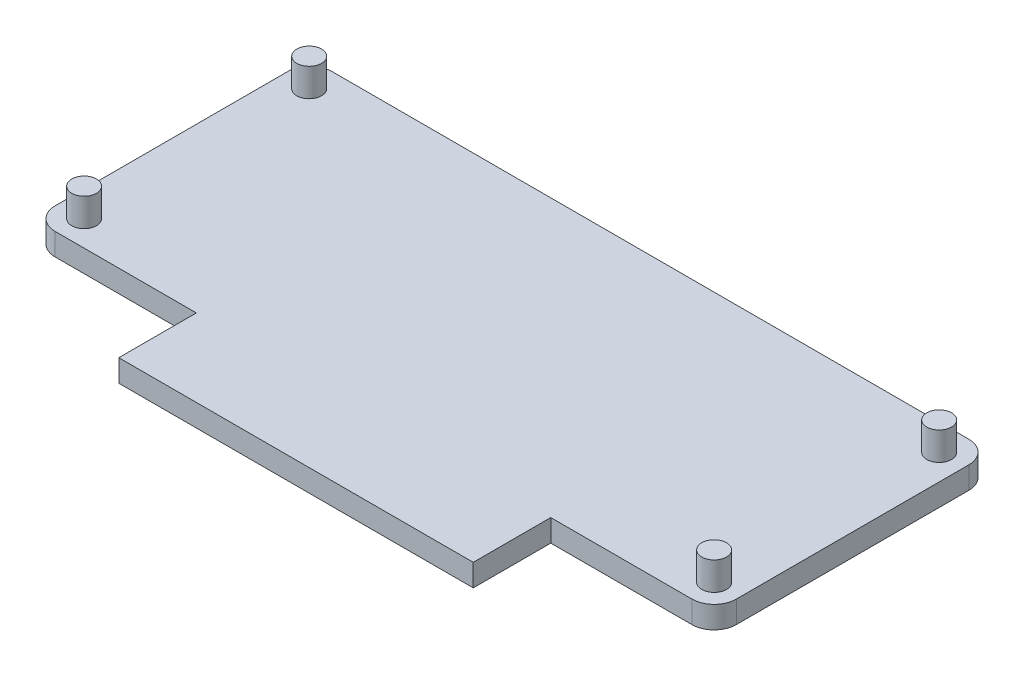
ISO-10303-21;
HEADER;
FILE_DESCRIPTION(('STEP AP214'),'2;1');
FILE_NAME('part.step','',(''),(''),'','','');
FILE_SCHEMA(('AUTOMOTIVE_DESIGN { 1 0 10303 214 1 1 1 1 }'));
ENDSEC;
DATA;
#1=APPLICATION_CONTEXT('core data for automotive mechanical design processes');
#2=APPLICATION_PROTOCOL_DEFINITION('international standard','automotive_design',2000,#1);
#3=PRODUCT_CONTEXT('',#1,'mechanical');
#4=PRODUCT('Part','Part','',(#3));
#5=PRODUCT_RELATED_PRODUCT_CATEGORY('part','',(#4));
#6=PRODUCT_DEFINITION_FORMATION('','',#4);
#7=PRODUCT_DEFINITION_CONTEXT('part definition',#1,'design');
#8=PRODUCT_DEFINITION('design','',#6,#7);
#9=PRODUCT_DEFINITION_SHAPE('','',#8);
#10=(LENGTH_UNIT() NAMED_UNIT(*) SI_UNIT(.MILLI.,.METRE.));
#11=(NAMED_UNIT(*) PLANE_ANGLE_UNIT() SI_UNIT($,.RADIAN.));
#12=(NAMED_UNIT(*) SI_UNIT($,.STERADIAN.) SOLID_ANGLE_UNIT());
#13=UNCERTAINTY_MEASURE_WITH_UNIT(LENGTH_MEASURE(1.E-05),#10,'distance_accuracy_value','');
#14=(GEOMETRIC_REPRESENTATION_CONTEXT(3) GLOBAL_UNCERTAINTY_ASSIGNED_CONTEXT((#13)) GLOBAL_UNIT_ASSIGNED_CONTEXT((#10,
#11,#12)) REPRESENTATION_CONTEXT('',''));
#15=CARTESIAN_POINT('',(0.,0.,0.));
#16=DIRECTION('',(0.,0.,1.));
#17=DIRECTION('',(1.,0.,0.));
#18=AXIS2_PLACEMENT_3D('',#15,#16,#17);
#19=CARTESIAN_POINT('',(-16.,2.,0.));
#20=DIRECTION('',(1.,0.,0.));
#21=DIRECTION('',(0.,0.,-1.));
#22=AXIS2_PLACEMENT_3D('',#19,#20,#21);
#23=PLANE('',#22);
#24=DIRECTION('',(0.,0.,1.));
#25=VECTOR('',#24,1.);
#26=CARTESIAN_POINT('',(-16.,0.,0.));
#27=LINE('',#26,#25);
#28=CARTESIAN_POINT('',(-16.,0.,-7.));
#29=VERTEX_POINT('',#28);
#30=CARTESIAN_POINT('',(-16.,0.,0.));
#31=VERTEX_POINT('',#30);
#32=EDGE_CURVE('E165',#29,#31,#27,.T.);
#33=ORIENTED_EDGE('',*,*,#32,.T.);
#34=DIRECTION('',(0.,-1.,0.));
#35=VECTOR('',#34,1.);
#36=CARTESIAN_POINT('',(-16.,2.,0.));
#37=LINE('',#36,#35);
#38=CARTESIAN_POINT('',(-16.,2.,0.));
#39=VERTEX_POINT('',#38);
#40=EDGE_CURVE('E145',#39,#31,#37,.T.);
#41=ORIENTED_EDGE('',*,*,#40,.F.);
#42=DIRECTION('',(0.,0.,1.));
#43=VECTOR('',#42,1.);
#44=CARTESIAN_POINT('',(-16.,2.,0.));
#45=LINE('',#44,#43);
#46=CARTESIAN_POINT('',(-16.,2.,-7.));
#47=VERTEX_POINT('',#46);
#48=EDGE_CURVE('E152',#47,#39,#45,.T.);
#49=ORIENTED_EDGE('',*,*,#48,.F.);
#50=DIRECTION('',(0.,-1.,0.));
#51=VECTOR('',#50,1.);
#52=CARTESIAN_POINT('',(-16.,2.,-7.));
#53=LINE('',#52,#51);
#54=EDGE_CURVE('E246',#47,#29,#53,.T.);
#55=ORIENTED_EDGE('',*,*,#54,.T.);
#56=EDGE_LOOP('',(#33,#41,#49,#55));
#57=FACE_BOUND('',#56,.T.);
#58=ADVANCED_FACE('F49',(#57),#23,.F.);
#59=CARTESIAN_POINT('',(-16.,2.,0.));
#60=DIRECTION('',(0.,0.,-1.));
#61=DIRECTION('',(-1.,0.,0.));
#62=AXIS2_PLACEMENT_3D('',#59,#60,#61);
#63=PLANE('',#62);
#64=DIRECTION('',(1.,0.,0.));
#65=VECTOR('',#64,1.);
#66=CARTESIAN_POINT('',(-16.,0.,0.));
#67=LINE('',#66,#65);
#68=CARTESIAN_POINT('',(16.,0.,0.));
#69=VERTEX_POINT('',#68);
#70=EDGE_CURVE('E268',#31,#69,#67,.T.);
#71=ORIENTED_EDGE('',*,*,#70,.T.);
#72=DIRECTION('',(0.,-1.,0.));
#73=VECTOR('',#72,1.);
#74=CARTESIAN_POINT('',(16.,2.,0.));
#75=LINE('',#74,#73);
#76=CARTESIAN_POINT('',(16.,2.,0.));
#77=VERTEX_POINT('',#76);
#78=EDGE_CURVE('E148',#77,#69,#75,.T.);
#79=ORIENTED_EDGE('',*,*,#78,.F.);
#80=DIRECTION('',(1.,0.,0.));
#81=VECTOR('',#80,1.);
#82=CARTESIAN_POINT('',(-16.,2.,0.));
#83=LINE('',#82,#81);
#84=EDGE_CURVE('E141',#39,#77,#83,.T.);
#85=ORIENTED_EDGE('',*,*,#84,.F.);
#86=ORIENTED_EDGE('',*,*,#40,.T.);
#87=EDGE_LOOP('',(#71,#79,#85,#86));
#88=FACE_BOUND('',#87,.T.);
#89=ADVANCED_FACE('F143',(#88),#63,.F.);
#90=CARTESIAN_POINT('',(16.,2.,0.));
#91=DIRECTION('',(-1.,0.,0.));
#92=DIRECTION('',(0.,0.,1.));
#93=AXIS2_PLACEMENT_3D('',#90,#91,#92);
#94=PLANE('',#93);
#95=DIRECTION('',(0.,0.,-1.));
#96=VECTOR('',#95,1.);
#97=CARTESIAN_POINT('',(16.,0.,0.));
#98=LINE('',#97,#96);
#99=CARTESIAN_POINT('',(16.,0.,-7.));
#100=VERTEX_POINT('',#99);
#101=EDGE_CURVE('E262',#69,#100,#98,.T.);
#102=ORIENTED_EDGE('',*,*,#101,.T.);
#103=DIRECTION('',(0.,-1.,0.));
#104=VECTOR('',#103,1.);
#105=CARTESIAN_POINT('',(16.,2.,-7.));
#106=LINE('',#105,#104);
#107=CARTESIAN_POINT('',(16.,2.,-7.));
#108=VERTEX_POINT('',#107);
#109=EDGE_CURVE('E175',#108,#100,#106,.T.);
#110=ORIENTED_EDGE('',*,*,#109,.F.);
#111=DIRECTION('',(0.,0.,-1.));
#112=VECTOR('',#111,1.);
#113=CARTESIAN_POINT('',(16.,2.,0.));
#114=LINE('',#113,#112);
#115=EDGE_CURVE('E151',#77,#108,#114,.T.);
#116=ORIENTED_EDGE('',*,*,#115,.F.);
#117=ORIENTED_EDGE('',*,*,#78,.T.);
#118=EDGE_LOOP('',(#102,#110,#116,#117));
#119=FACE_BOUND('',#118,.T.);
#120=ADVANCED_FACE('F351',(#119),#94,.F.);
#121=CARTESIAN_POINT('',(16.,2.,-7.));
#122=DIRECTION('',(0.,0.,-1.));
#123=DIRECTION('',(-1.,0.,0.));
#124=AXIS2_PLACEMENT_3D('',#121,#122,#123);
#125=PLANE('',#124);
#126=DIRECTION('',(1.,0.,0.));
#127=VECTOR('',#126,1.);
#128=CARTESIAN_POINT('',(16.,0.,-7.));
#129=LINE('',#128,#127);
#130=CARTESIAN_POINT('',(28.75,0.,-7.));
#131=VERTEX_POINT('',#130);
#132=EDGE_CURVE('E257',#100,#131,#129,.T.);
#133=ORIENTED_EDGE('',*,*,#132,.T.);
#134=DIRECTION('',(0.,-1.,0.));
#135=VECTOR('',#134,1.);
#136=CARTESIAN_POINT('',(28.75,2.,-7.));
#137=LINE('',#136,#135);
#138=CARTESIAN_POINT('',(28.75,2.,-7.));
#139=VERTEX_POINT('',#138);
#140=EDGE_CURVE('E194',#131,#139,#137,.F.);
#141=ORIENTED_EDGE('',*,*,#140,.T.);
#142=DIRECTION('',(1.,0.,0.));
#143=VECTOR('',#142,1.);
#144=CARTESIAN_POINT('',(16.,2.,-7.));
#145=LINE('',#144,#143);
#146=EDGE_CURVE('E259',#108,#139,#145,.T.);
#147=ORIENTED_EDGE('',*,*,#146,.F.);
#148=ORIENTED_EDGE('',*,*,#109,.T.);
#149=EDGE_LOOP('',(#133,#141,#147,#148));
#150=FACE_BOUND('',#149,.T.);
#151=ADVANCED_FACE('F256',(#150),#125,.F.);
#152=CARTESIAN_POINT('',(30.75,2.,-7.));
#153=DIRECTION('',(-1.,0.,0.));
#154=DIRECTION('',(0.,0.,1.));
#155=AXIS2_PLACEMENT_3D('',#152,#153,#154);
#156=PLANE('',#155);
#157=DIRECTION('',(0.,0.,-1.));
#158=VECTOR('',#157,1.);
#159=CARTESIAN_POINT('',(30.75,2.,-7.));
#160=LINE('',#159,#158);
#161=CARTESIAN_POINT('',(30.75,2.,-9.));
#162=VERTEX_POINT('',#161);
#163=CARTESIAN_POINT('',(30.75,2.,-30.));
#164=VERTEX_POINT('',#163);
#165=EDGE_CURVE('E283',#162,#164,#160,.T.);
#166=ORIENTED_EDGE('',*,*,#165,.F.);
#167=DIRECTION('',(0.,-1.,0.));
#168=VECTOR('',#167,1.);
#169=CARTESIAN_POINT('',(30.75,2.,-9.));
#170=LINE('',#169,#168);
#171=CARTESIAN_POINT('',(30.75,0.,-9.));
#172=VERTEX_POINT('',#171);
#173=EDGE_CURVE('E172',#162,#172,#170,.T.);
#174=ORIENTED_EDGE('',*,*,#173,.T.);
#175=DIRECTION('',(0.,0.,-1.));
#176=VECTOR('',#175,1.);
#177=CARTESIAN_POINT('',(30.75,0.,-7.));
#178=LINE('',#177,#176);
#179=CARTESIAN_POINT('',(30.75,0.,-30.));
#180=VERTEX_POINT('',#179);
#181=EDGE_CURVE('E242',#172,#180,#178,.T.);
#182=ORIENTED_EDGE('',*,*,#181,.T.);
#183=DIRECTION('',(0.,-1.,0.));
#184=VECTOR('',#183,1.);
#185=CARTESIAN_POINT('',(30.75,2.,-30.));
#186=LINE('',#185,#184);
#187=EDGE_CURVE('E167',#180,#164,#186,.F.);
#188=ORIENTED_EDGE('',*,*,#187,.T.);
#189=EDGE_LOOP('',(#166,#174,#182,#188));
#190=FACE_BOUND('',#189,.T.);
#191=ADVANCED_FACE('F377',(#190),#156,.F.);
#192=CARTESIAN_POINT('',(-30.75,2.,-32.));
#193=DIRECTION('',(0.,0.,1.));
#194=DIRECTION('',(1.,0.,0.));
#195=AXIS2_PLACEMENT_3D('',#192,#193,#194);
#196=PLANE('',#195);
#197=DIRECTION('',(-1.,0.,0.));
#198=VECTOR('',#197,1.);
#199=CARTESIAN_POINT('',(-30.75,2.,-32.));
#200=LINE('',#199,#198);
#201=CARTESIAN_POINT('',(28.75,2.,-32.));
#202=VERTEX_POINT('',#201);
#203=CARTESIAN_POINT('',(-28.75,2.,-32.));
#204=VERTEX_POINT('',#203);
#205=EDGE_CURVE('E279',#202,#204,#200,.T.);
#206=ORIENTED_EDGE('',*,*,#205,.F.);
#207=DIRECTION('',(0.,-1.,0.));
#208=VECTOR('',#207,1.);
#209=CARTESIAN_POINT('',(28.75,2.,-32.));
#210=LINE('',#209,#208);
#211=CARTESIAN_POINT('',(28.75,0.,-32.));
#212=VERTEX_POINT('',#211);
#213=EDGE_CURVE('E211',#202,#212,#210,.T.);
#214=ORIENTED_EDGE('',*,*,#213,.T.);
#215=DIRECTION('',(-1.,0.,0.));
#216=VECTOR('',#215,1.);
#217=CARTESIAN_POINT('',(-30.75,0.,-32.));
#218=LINE('',#217,#216);
#219=CARTESIAN_POINT('',(-28.75,0.,-32.));
#220=VERTEX_POINT('',#219);
#221=EDGE_CURVE('E235',#212,#220,#218,.T.);
#222=ORIENTED_EDGE('',*,*,#221,.T.);
#223=DIRECTION('',(0.,-1.,0.));
#224=VECTOR('',#223,1.);
#225=CARTESIAN_POINT('',(-28.75,2.,-32.));
#226=LINE('',#225,#224);
#227=EDGE_CURVE('E208',#220,#204,#226,.F.);
#228=ORIENTED_EDGE('',*,*,#227,.T.);
#229=EDGE_LOOP('',(#206,#214,#222,#228));
#230=FACE_BOUND('',#229,.T.);
#231=ADVANCED_FACE('F373',(#230),#196,.F.);
#232=CARTESIAN_POINT('',(-30.75,2.,-7.));
#233=DIRECTION('',(1.,0.,0.));
#234=DIRECTION('',(0.,0.,-1.));
#235=AXIS2_PLACEMENT_3D('',#232,#233,#234);
#236=PLANE('',#235);
#237=DIRECTION('',(0.,0.,1.));
#238=VECTOR('',#237,1.);
#239=CARTESIAN_POINT('',(-30.75,2.,-7.));
#240=LINE('',#239,#238);
#241=CARTESIAN_POINT('',(-30.75,2.,-30.));
#242=VERTEX_POINT('',#241);
#243=CARTESIAN_POINT('',(-30.75,2.,-9.));
#244=VERTEX_POINT('',#243);
#245=EDGE_CURVE('E225',#242,#244,#240,.T.);
#246=ORIENTED_EDGE('',*,*,#245,.F.);
#247=DIRECTION('',(0.,-1.,0.));
#248=VECTOR('',#247,1.);
#249=CARTESIAN_POINT('',(-30.75,2.,-30.));
#250=LINE('',#249,#248);
#251=CARTESIAN_POINT('',(-30.75,0.,-30.));
#252=VERTEX_POINT('',#251);
#253=EDGE_CURVE('E58',#242,#252,#250,.T.);
#254=ORIENTED_EDGE('',*,*,#253,.T.);
#255=DIRECTION('',(0.,0.,1.));
#256=VECTOR('',#255,1.);
#257=CARTESIAN_POINT('',(-30.75,0.,-7.));
#258=LINE('',#257,#256);
#259=CARTESIAN_POINT('',(-30.75,0.,-9.));
#260=VERTEX_POINT('',#259);
#261=EDGE_CURVE('E224',#252,#260,#258,.T.);
#262=ORIENTED_EDGE('',*,*,#261,.T.);
#263=DIRECTION('',(0.,-1.,0.));
#264=VECTOR('',#263,1.);
#265=CARTESIAN_POINT('',(-30.75,2.,-9.));
#266=LINE('',#265,#264);
#267=EDGE_CURVE('E73',#260,#244,#266,.F.);
#268=ORIENTED_EDGE('',*,*,#267,.T.);
#269=EDGE_LOOP('',(#246,#254,#262,#268));
#270=FACE_BOUND('',#269,.T.);
#271=ADVANCED_FACE('F223',(#270),#236,.F.);
#272=CARTESIAN_POINT('',(-16.,2.,-7.));
#273=DIRECTION('',(0.,0.,-1.));
#274=DIRECTION('',(-1.,0.,0.));
#275=AXIS2_PLACEMENT_3D('',#272,#273,#274);
#276=PLANE('',#275);
#277=DIRECTION('',(1.,0.,0.));
#278=VECTOR('',#277,1.);
#279=CARTESIAN_POINT('',(-16.,2.,-7.));
#280=LINE('',#279,#278);
#281=CARTESIAN_POINT('',(-28.75,2.,-7.));
#282=VERTEX_POINT('',#281);
#283=EDGE_CURVE('E157',#282,#47,#280,.T.);
#284=ORIENTED_EDGE('',*,*,#283,.F.);
#285=DIRECTION('',(0.,-1.,0.));
#286=VECTOR('',#285,1.);
#287=CARTESIAN_POINT('',(-28.75,2.,-7.));
#288=LINE('',#287,#286);
#289=CARTESIAN_POINT('',(-28.75,0.,-7.));
#290=VERTEX_POINT('',#289);
#291=EDGE_CURVE('E11',#282,#290,#288,.T.);
#292=ORIENTED_EDGE('',*,*,#291,.T.);
#293=DIRECTION('',(1.,0.,0.));
#294=VECTOR('',#293,1.);
#295=CARTESIAN_POINT('',(-16.,0.,-7.));
#296=LINE('',#295,#294);
#297=EDGE_CURVE('E162',#290,#29,#296,.T.);
#298=ORIENTED_EDGE('',*,*,#297,.T.);
#299=ORIENTED_EDGE('',*,*,#54,.F.);
#300=EDGE_LOOP('',(#284,#292,#298,#299));
#301=FACE_BOUND('',#300,.T.);
#302=ADVANCED_FACE('F326',(#301),#276,.F.);
#303=CARTESIAN_POINT('',(0.,2.,0.));
#304=DIRECTION('',(0.,1.,0.));
#305=DIRECTION('',(0.,0.,1.));
#306=AXIS2_PLACEMENT_3D('',#303,#304,#305);
#307=PLANE('',#306);
#308=CARTESIAN_POINT('',(28.44076,2.,-9.31));
#309=DIRECTION('',(0.,1.,0.));
#310=DIRECTION('',(0.,0.,1.));
#311=AXIS2_PLACEMENT_3D('',#308,#309,#310);
#312=CIRCLE('',#311,1.1176);
#313=CARTESIAN_POINT('',(28.44076,2.,-8.1924));
#314=VERTEX_POINT('',#313);
#315=EDGE_CURVE('E309',#314,#314,#312,.T.);
#316=ORIENTED_EDGE('',*,*,#315,.F.);
#317=EDGE_LOOP('',(#316));
#318=FACE_BOUND('',#317,.T.);
#319=CARTESIAN_POINT('',(28.44076,2.,-29.63));
#320=DIRECTION('',(0.,1.,0.));
#321=DIRECTION('',(0.,0.,1.));
#322=AXIS2_PLACEMENT_3D('',#319,#320,#321);
#323=CIRCLE('',#322,1.1176);
#324=CARTESIAN_POINT('',(28.44076,2.,-28.5124));
#325=VERTEX_POINT('',#324);
#326=EDGE_CURVE('E302',#325,#325,#323,.T.);
#327=ORIENTED_EDGE('',*,*,#326,.F.);
#328=EDGE_LOOP('',(#327));
#329=FACE_BOUND('',#328,.T.);
#330=CARTESIAN_POINT('',(-28.44,2.,-29.63));
#331=DIRECTION('',(0.,1.,0.));
#332=DIRECTION('',(0.,0.,1.));
#333=AXIS2_PLACEMENT_3D('',#330,#331,#332);
#334=CIRCLE('',#333,1.1176);
#335=CARTESIAN_POINT('',(-28.44,2.,-28.5124));
#336=VERTEX_POINT('',#335);
#337=EDGE_CURVE('E294',#336,#336,#334,.T.);
#338=ORIENTED_EDGE('',*,*,#337,.F.);
#339=EDGE_LOOP('',(#338));
#340=FACE_BOUND('',#339,.T.);
#341=CARTESIAN_POINT('',(-28.44,2.,-9.31));
#342=DIRECTION('',(0.,1.,0.));
#343=DIRECTION('',(0.,0.,1.));
#344=AXIS2_PLACEMENT_3D('',#341,#342,#343);
#345=CIRCLE('',#344,1.1176);
#346=CARTESIAN_POINT('',(-28.44,2.,-8.1924));
#347=VERTEX_POINT('',#346);
#348=EDGE_CURVE('E291',#347,#347,#345,.T.);
#349=ORIENTED_EDGE('',*,*,#348,.F.);
#350=EDGE_LOOP('',(#349));
#351=FACE_BOUND('',#350,.T.);
#352=ORIENTED_EDGE('',*,*,#146,.T.);
#353=CARTESIAN_POINT('',(28.75,2.,-9.));
#354=DIRECTION('',(0.,1.,0.));
#355=DIRECTION('',(0.,0.,1.));
#356=AXIS2_PLACEMENT_3D('',#353,#354,#355);
#357=CIRCLE('',#356,2.);
#358=EDGE_CURVE('E205',#139,#162,#357,.T.);
#359=ORIENTED_EDGE('',*,*,#358,.T.);
#360=ORIENTED_EDGE('',*,*,#165,.T.);
#361=CARTESIAN_POINT('',(28.75,2.,-30.));
#362=DIRECTION('',(0.,1.,0.));
#363=DIRECTION('',(0.,0.,1.));
#364=AXIS2_PLACEMENT_3D('',#361,#362,#363);
#365=CIRCLE('',#364,2.);
#366=EDGE_CURVE('E202',#164,#202,#365,.T.);
#367=ORIENTED_EDGE('',*,*,#366,.T.);
#368=ORIENTED_EDGE('',*,*,#205,.T.);
#369=CARTESIAN_POINT('',(-28.75,2.,-30.));
#370=DIRECTION('',(0.,1.,0.));
#371=DIRECTION('',(0.,0.,1.));
#372=AXIS2_PLACEMENT_3D('',#369,#370,#371);
#373=CIRCLE('',#372,2.);
#374=EDGE_CURVE('E199',#204,#242,#373,.T.);
#375=ORIENTED_EDGE('',*,*,#374,.T.);
#376=ORIENTED_EDGE('',*,*,#245,.T.);
#377=CARTESIAN_POINT('',(-28.75,2.,-9.));
#378=DIRECTION('',(0.,1.,0.));
#379=DIRECTION('',(0.,0.,1.));
#380=AXIS2_PLACEMENT_3D('',#377,#378,#379);
#381=CIRCLE('',#380,2.);
#382=EDGE_CURVE('E65',#244,#282,#381,.T.);
#383=ORIENTED_EDGE('',*,*,#382,.T.);
#384=ORIENTED_EDGE('',*,*,#283,.T.);
#385=ORIENTED_EDGE('',*,*,#48,.T.);
#386=ORIENTED_EDGE('',*,*,#84,.T.);
#387=ORIENTED_EDGE('',*,*,#115,.T.);
#388=EDGE_LOOP('',(#352,#359,#360,#367,#368,#375,#376,#383,#384,#385,#386,#387));
#389=FACE_BOUND('',#388,.T.);
#390=ADVANCED_FACE('F156',(#318,#329,#340,#351,#389),#307,.T.);
#391=CARTESIAN_POINT('',(0.,0.,0.));
#392=DIRECTION('',(0.,1.,0.));
#393=DIRECTION('',(0.,0.,1.));
#394=AXIS2_PLACEMENT_3D('',#391,#392,#393);
#395=PLANE('',#394);
#396=ORIENTED_EDGE('',*,*,#181,.F.);
#397=CARTESIAN_POINT('',(28.75,0.,-9.));
#398=DIRECTION('',(0.,1.,0.));
#399=DIRECTION('',(0.,0.,1.));
#400=AXIS2_PLACEMENT_3D('',#397,#398,#399);
#401=CIRCLE('',#400,2.);
#402=EDGE_CURVE('E191',#172,#131,#401,.F.);
#403=ORIENTED_EDGE('',*,*,#402,.T.);
#404=ORIENTED_EDGE('',*,*,#132,.F.);
#405=ORIENTED_EDGE('',*,*,#101,.F.);
#406=ORIENTED_EDGE('',*,*,#70,.F.);
#407=ORIENTED_EDGE('',*,*,#32,.F.);
#408=ORIENTED_EDGE('',*,*,#297,.F.);
#409=CARTESIAN_POINT('',(-28.75,0.,-9.));
#410=DIRECTION('',(0.,1.,0.));
#411=DIRECTION('',(0.,0.,1.));
#412=AXIS2_PLACEMENT_3D('',#409,#410,#411);
#413=CIRCLE('',#412,2.);
#414=EDGE_CURVE('E182',#290,#260,#413,.F.);
#415=ORIENTED_EDGE('',*,*,#414,.T.);
#416=ORIENTED_EDGE('',*,*,#261,.F.);
#417=CARTESIAN_POINT('',(-28.75,0.,-30.));
#418=DIRECTION('',(0.,1.,0.));
#419=DIRECTION('',(0.,0.,1.));
#420=AXIS2_PLACEMENT_3D('',#417,#418,#419);
#421=CIRCLE('',#420,2.);
#422=EDGE_CURVE('E185',#252,#220,#421,.F.);
#423=ORIENTED_EDGE('',*,*,#422,.T.);
#424=ORIENTED_EDGE('',*,*,#221,.F.);
#425=CARTESIAN_POINT('',(28.75,0.,-30.));
#426=DIRECTION('',(0.,1.,0.));
#427=DIRECTION('',(0.,0.,1.));
#428=AXIS2_PLACEMENT_3D('',#425,#426,#427);
#429=CIRCLE('',#428,2.);
#430=EDGE_CURVE('E188',#212,#180,#429,.F.);
#431=ORIENTED_EDGE('',*,*,#430,.T.);
#432=EDGE_LOOP('',(#396,#403,#404,#405,#406,#407,#408,#415,#416,#423,#424,#431));
#433=FACE_BOUND('',#432,.T.);
#434=ADVANCED_FACE('F230',(#433),#395,.F.);
#435=CARTESIAN_POINT('',(-28.44,4.54,-9.31));
#436=DIRECTION('',(0.,-1.,0.));
#437=DIRECTION('',(0.,0.,-1.));
#438=AXIS2_PLACEMENT_3D('',#435,#436,#437);
#439=CYLINDRICAL_SURFACE('',#438,1.1176);
#440=CARTESIAN_POINT('',(-28.44,4.54,-9.31));
#441=DIRECTION('',(0.,1.,0.));
#442=DIRECTION('',(0.,0.,1.));
#443=AXIS2_PLACEMENT_3D('',#440,#441,#442);
#444=CIRCLE('',#443,1.1176);
#445=CARTESIAN_POINT('',(-28.44,4.54,-8.1924));
#446=VERTEX_POINT('',#445);
#447=EDGE_CURVE('E275',#446,#446,#444,.T.);
#448=ORIENTED_EDGE('',*,*,#447,.F.);
#449=EDGE_LOOP('',(#448));
#450=FACE_BOUND('',#449,.T.);
#451=ORIENTED_EDGE('',*,*,#348,.T.);
#452=EDGE_LOOP('',(#451));
#453=FACE_BOUND('',#452,.T.);
#454=ADVANCED_FACE('F334',(#450,#453),#439,.T.);
#455=CARTESIAN_POINT('',(-28.44,4.54,-9.31));
#456=DIRECTION('',(0.,1.,0.));
#457=DIRECTION('',(0.,0.,1.));
#458=AXIS2_PLACEMENT_3D('',#455,#456,#457);
#459=PLANE('',#458);
#460=ORIENTED_EDGE('',*,*,#447,.T.);
#461=EDGE_LOOP('',(#460));
#462=FACE_BOUND('',#461,.T.);
#463=ADVANCED_FACE('F336',(#462),#459,.T.);
#464=CARTESIAN_POINT('',(-28.44,4.54,-29.63));
#465=DIRECTION('',(0.,-1.,0.));
#466=DIRECTION('',(0.,0.,-1.));
#467=AXIS2_PLACEMENT_3D('',#464,#465,#466);
#468=CYLINDRICAL_SURFACE('',#467,1.1176);
#469=CARTESIAN_POINT('',(-28.44,4.54,-29.63));
#470=DIRECTION('',(0.,1.,0.));
#471=DIRECTION('',(0.,0.,1.));
#472=AXIS2_PLACEMENT_3D('',#469,#470,#471);
#473=CIRCLE('',#472,1.1176);
#474=CARTESIAN_POINT('',(-28.44,4.54,-28.5124));
#475=VERTEX_POINT('',#474);
#476=EDGE_CURVE('E298',#475,#475,#473,.T.);
#477=ORIENTED_EDGE('',*,*,#476,.F.);
#478=EDGE_LOOP('',(#477));
#479=FACE_BOUND('',#478,.T.);
#480=ORIENTED_EDGE('',*,*,#337,.T.);
#481=EDGE_LOOP('',(#480));
#482=FACE_BOUND('',#481,.T.);
#483=ADVANCED_FACE('F342',(#479,#482),#468,.T.);
#484=CARTESIAN_POINT('',(-28.44,4.54,-29.63));
#485=DIRECTION('',(0.,1.,0.));
#486=DIRECTION('',(0.,0.,1.));
#487=AXIS2_PLACEMENT_3D('',#484,#485,#486);
#488=PLANE('',#487);
#489=ORIENTED_EDGE('',*,*,#476,.T.);
#490=EDGE_LOOP('',(#489));
#491=FACE_BOUND('',#490,.T.);
#492=ADVANCED_FACE('F469',(#491),#488,.T.);
#493=CARTESIAN_POINT('',(28.44076,4.54,-29.63));
#494=DIRECTION('',(0.,-1.,0.));
#495=DIRECTION('',(0.,0.,-1.));
#496=AXIS2_PLACEMENT_3D('',#493,#494,#495);
#497=CYLINDRICAL_SURFACE('',#496,1.1176);
#498=CARTESIAN_POINT('',(28.44076,4.54,-29.63));
#499=DIRECTION('',(0.,1.,0.));
#500=DIRECTION('',(0.,0.,1.));
#501=AXIS2_PLACEMENT_3D('',#498,#499,#500);
#502=CIRCLE('',#501,1.1176);
#503=CARTESIAN_POINT('',(28.44076,4.54,-28.5124));
#504=VERTEX_POINT('',#503);
#505=EDGE_CURVE('E306',#504,#504,#502,.T.);
#506=ORIENTED_EDGE('',*,*,#505,.F.);
#507=EDGE_LOOP('',(#506));
#508=FACE_BOUND('',#507,.T.);
#509=ORIENTED_EDGE('',*,*,#326,.T.);
#510=EDGE_LOOP('',(#509));
#511=FACE_BOUND('',#510,.T.);
#512=ADVANCED_FACE('F459',(#508,#511),#497,.T.);
#513=CARTESIAN_POINT('',(28.44076,4.54,-29.63));
#514=DIRECTION('',(0.,1.,0.));
#515=DIRECTION('',(0.,0.,1.));
#516=AXIS2_PLACEMENT_3D('',#513,#514,#515);
#517=PLANE('',#516);
#518=ORIENTED_EDGE('',*,*,#505,.T.);
#519=EDGE_LOOP('',(#518));
#520=FACE_BOUND('',#519,.T.);
#521=ADVANCED_FACE('F449',(#520),#517,.T.);
#522=CARTESIAN_POINT('',(28.44076,4.54,-9.31));
#523=DIRECTION('',(0.,-1.,0.));
#524=DIRECTION('',(0.,0.,-1.));
#525=AXIS2_PLACEMENT_3D('',#522,#523,#524);
#526=CYLINDRICAL_SURFACE('',#525,1.1176);
#527=CARTESIAN_POINT('',(28.44076,4.54,-9.31));
#528=DIRECTION('',(0.,1.,0.));
#529=DIRECTION('',(0.,0.,1.));
#530=AXIS2_PLACEMENT_3D('',#527,#528,#529);
#531=CIRCLE('',#530,1.1176);
#532=CARTESIAN_POINT('',(28.44076,4.54,-8.1924));
#533=VERTEX_POINT('',#532);
#534=EDGE_CURVE('E313',#533,#533,#531,.T.);
#535=ORIENTED_EDGE('',*,*,#534,.F.);
#536=EDGE_LOOP('',(#535));
#537=FACE_BOUND('',#536,.T.);
#538=ORIENTED_EDGE('',*,*,#315,.T.);
#539=EDGE_LOOP('',(#538));
#540=FACE_BOUND('',#539,.T.);
#541=ADVANCED_FACE('F322',(#537,#540),#526,.T.);
#542=CARTESIAN_POINT('',(28.44076,4.54,-9.31));
#543=DIRECTION('',(0.,1.,0.));
#544=DIRECTION('',(0.,0.,1.));
#545=AXIS2_PLACEMENT_3D('',#542,#543,#544);
#546=PLANE('',#545);
#547=ORIENTED_EDGE('',*,*,#534,.T.);
#548=EDGE_LOOP('',(#547));
#549=FACE_BOUND('',#548,.T.);
#550=ADVANCED_FACE('F359',(#549),#546,.T.);
#551=CARTESIAN_POINT('',(28.75,2.,-9.));
#552=DIRECTION('',(0.,-1.,0.));
#553=DIRECTION('',(0.,0.,-1.));
#554=AXIS2_PLACEMENT_3D('',#551,#552,#553);
#555=CYLINDRICAL_SURFACE('',#554,2.);
#556=ORIENTED_EDGE('',*,*,#358,.F.);
#557=ORIENTED_EDGE('',*,*,#140,.F.);
#558=ORIENTED_EDGE('',*,*,#402,.F.);
#559=ORIENTED_EDGE('',*,*,#173,.F.);
#560=EDGE_LOOP('',(#556,#557,#558,#559));
#561=FACE_BOUND('',#560,.T.);
#562=ADVANCED_FACE('F355',(#561),#555,.T.);
#563=CARTESIAN_POINT('',(28.75,2.,-30.));
#564=DIRECTION('',(0.,-1.,0.));
#565=DIRECTION('',(0.,0.,-1.));
#566=AXIS2_PLACEMENT_3D('',#563,#564,#565);
#567=CYLINDRICAL_SURFACE('',#566,2.);
#568=ORIENTED_EDGE('',*,*,#366,.F.);
#569=ORIENTED_EDGE('',*,*,#187,.F.);
#570=ORIENTED_EDGE('',*,*,#430,.F.);
#571=ORIENTED_EDGE('',*,*,#213,.F.);
#572=EDGE_LOOP('',(#568,#569,#570,#571));
#573=FACE_BOUND('',#572,.T.);
#574=ADVANCED_FACE('F358',(#573),#567,.T.);
#575=CARTESIAN_POINT('',(-28.75,2.,-30.));
#576=DIRECTION('',(0.,-1.,0.));
#577=DIRECTION('',(0.,0.,-1.));
#578=AXIS2_PLACEMENT_3D('',#575,#576,#577);
#579=CYLINDRICAL_SURFACE('',#578,2.);
#580=ORIENTED_EDGE('',*,*,#374,.F.);
#581=ORIENTED_EDGE('',*,*,#227,.F.);
#582=ORIENTED_EDGE('',*,*,#422,.F.);
#583=ORIENTED_EDGE('',*,*,#253,.F.);
#584=EDGE_LOOP('',(#580,#581,#582,#583));
#585=FACE_BOUND('',#584,.T.);
#586=ADVANCED_FACE('F362',(#585),#579,.T.);
#587=CARTESIAN_POINT('',(-28.75,2.,-9.));
#588=DIRECTION('',(0.,-1.,0.));
#589=DIRECTION('',(0.,0.,-1.));
#590=AXIS2_PLACEMENT_3D('',#587,#588,#589);
#591=CYLINDRICAL_SURFACE('',#590,2.);
#592=ORIENTED_EDGE('',*,*,#382,.F.);
#593=ORIENTED_EDGE('',*,*,#267,.F.);
#594=ORIENTED_EDGE('',*,*,#414,.F.);
#595=ORIENTED_EDGE('',*,*,#291,.F.);
#596=EDGE_LOOP('',(#592,#593,#594,#595));
#597=FACE_BOUND('',#596,.T.);
#598=ADVANCED_FACE('F51',(#597),#591,.T.);
#599=CLOSED_SHELL('',(#58,#89,#120,#151,#191,#231,#271,#302,#390,#434,#454,#463,#483,#492,#512,
#521,#541,#550,#562,#574,#586,#598));
#600=MANIFOLD_SOLID_BREP('B2',#599);
#601=ADVANCED_BREP_SHAPE_REPRESENTATION('',(#18,#600),#14);
#602=SHAPE_DEFINITION_REPRESENTATION(#9,#601);
ENDSEC;
END-ISO-10303-21;
